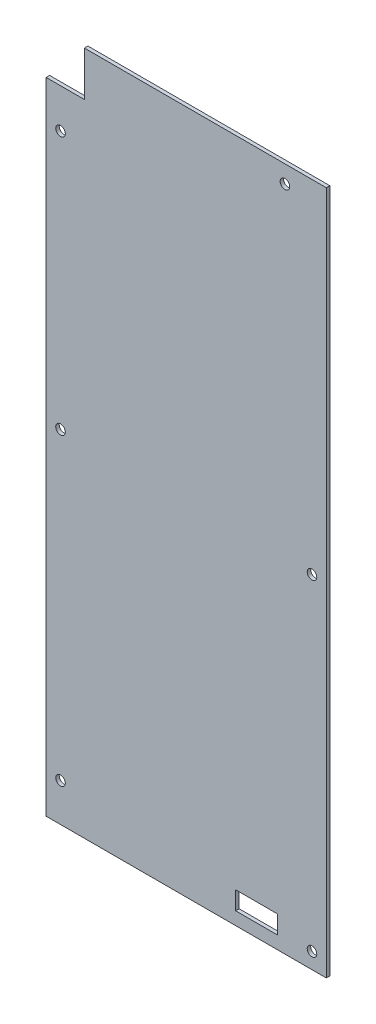
ISO-10303-21;
HEADER;
FILE_DESCRIPTION(('STEP AP214'),'2;1');
FILE_NAME('part.step','',(''),(''),'','','');
FILE_SCHEMA(('AUTOMOTIVE_DESIGN { 1 0 10303 214 1 1 1 1 }'));
ENDSEC;
DATA;
#1=APPLICATION_CONTEXT('core data for automotive mechanical design processes');
#2=APPLICATION_PROTOCOL_DEFINITION('international standard','automotive_design',2000,#1);
#3=PRODUCT_CONTEXT('',#1,'mechanical');
#4=PRODUCT('Part','Part','',(#3));
#5=PRODUCT_RELATED_PRODUCT_CATEGORY('part','',(#4));
#6=PRODUCT_DEFINITION_FORMATION('','',#4);
#7=PRODUCT_DEFINITION_CONTEXT('part definition',#1,'design');
#8=PRODUCT_DEFINITION('design','',#6,#7);
#9=PRODUCT_DEFINITION_SHAPE('','',#8);
#10=(LENGTH_UNIT() NAMED_UNIT(*) SI_UNIT(.MILLI.,.METRE.));
#11=(NAMED_UNIT(*) PLANE_ANGLE_UNIT() SI_UNIT($,.RADIAN.));
#12=(NAMED_UNIT(*) SI_UNIT($,.STERADIAN.) SOLID_ANGLE_UNIT());
#13=UNCERTAINTY_MEASURE_WITH_UNIT(LENGTH_MEASURE(1.E-05),#10,'distance_accuracy_value','');
#14=(GEOMETRIC_REPRESENTATION_CONTEXT(3) GLOBAL_UNCERTAINTY_ASSIGNED_CONTEXT((#13)) GLOBAL_UNIT_ASSIGNED_CONTEXT((#10,
#11,#12)) REPRESENTATION_CONTEXT('',''));
#15=CARTESIAN_POINT('',(0.,0.,0.));
#16=DIRECTION('',(0.,0.,1.));
#17=DIRECTION('',(1.,0.,0.));
#18=AXIS2_PLACEMENT_3D('',#15,#16,#17);
#19=CARTESIAN_POINT('',(-43.4054880311596,36.5751828079822,1.1));
#20=DIRECTION('',(1.,0.,0.));
#21=DIRECTION('',(0.,0.,-1.));
#22=AXIS2_PLACEMENT_3D('',#19,#20,#21);
#23=PLANE('',#22);
#24=DIRECTION('',(0.,-1.,0.));
#25=VECTOR('',#24,1.);
#26=CARTESIAN_POINT('',(-43.4054880311596,36.5751828079822,1.1));
#27=LINE('',#26,#25);
#28=CARTESIAN_POINT('',(-43.4054880311596,22.5761319376729,1.1));
#29=VERTEX_POINT('',#28);
#30=CARTESIAN_POINT('',(-43.4054880311596,-178.424817192018,1.1));
#31=VERTEX_POINT('',#30);
#32=EDGE_CURVE('E220',#29,#31,#27,.T.);
#33=ORIENTED_EDGE('',*,*,#32,.F.);
#34=DIRECTION('',(0.,0.,1.));
#35=VECTOR('',#34,1.);
#36=CARTESIAN_POINT('',(-43.4054880311596,22.5761319376729,0.));
#37=LINE('',#36,#35);
#38=CARTESIAN_POINT('',(-43.4054880311596,22.5761319376729,0.));
#39=VERTEX_POINT('',#38);
#40=EDGE_CURVE('E174',#39,#29,#37,.T.);
#41=ORIENTED_EDGE('',*,*,#40,.F.);
#42=DIRECTION('',(0.,-1.,0.));
#43=VECTOR('',#42,1.);
#44=CARTESIAN_POINT('',(-43.4054880311596,36.5751828079822,0.));
#45=LINE('',#44,#43);
#46=CARTESIAN_POINT('',(-43.4054880311596,-178.424817192018,0.));
#47=VERTEX_POINT('',#46);
#48=EDGE_CURVE('E219',#39,#47,#45,.T.);
#49=ORIENTED_EDGE('',*,*,#48,.T.);
#50=DIRECTION('',(0.,0.,-1.));
#51=VECTOR('',#50,1.);
#52=CARTESIAN_POINT('',(-43.4054880311596,-178.424817192018,1.1));
#53=LINE('',#52,#51);
#54=EDGE_CURVE('E12',#31,#47,#53,.T.);
#55=ORIENTED_EDGE('',*,*,#54,.F.);
#56=EDGE_LOOP('',(#33,#41,#49,#55));
#57=FACE_BOUND('',#56,.T.);
#58=ADVANCED_FACE('F44',(#57),#23,.F.);
#59=CARTESIAN_POINT('',(-43.4054880311596,-178.424817192018,1.1));
#60=DIRECTION('',(0.,1.,0.));
#61=DIRECTION('',(-1.,0.,0.));
#62=AXIS2_PLACEMENT_3D('',#59,#60,#61);
#63=PLANE('',#62);
#64=DIRECTION('',(1.,0.,0.));
#65=VECTOR('',#64,1.);
#66=CARTESIAN_POINT('',(-43.4054880311596,-178.424817192018,0.));
#67=LINE('',#66,#65);
#68=CARTESIAN_POINT('',(44.5945119688404,-178.424817192018,0.));
#69=VERTEX_POINT('',#68);
#70=EDGE_CURVE('E233',#47,#69,#67,.T.);
#71=ORIENTED_EDGE('',*,*,#70,.T.);
#72=DIRECTION('',(0.,0.,-1.));
#73=VECTOR('',#72,1.);
#74=CARTESIAN_POINT('',(44.5945119688404,-178.424817192018,1.1));
#75=LINE('',#74,#73);
#76=CARTESIAN_POINT('',(44.5945119688404,-178.424817192018,1.1));
#77=VERTEX_POINT('',#76);
#78=EDGE_CURVE('E52',#77,#69,#75,.T.);
#79=ORIENTED_EDGE('',*,*,#78,.F.);
#80=DIRECTION('',(1.,0.,0.));
#81=VECTOR('',#80,1.);
#82=CARTESIAN_POINT('',(-43.4054880311596,-178.424817192018,1.1));
#83=LINE('',#82,#81);
#84=EDGE_CURVE('E222',#31,#77,#83,.T.);
#85=ORIENTED_EDGE('',*,*,#84,.F.);
#86=ORIENTED_EDGE('',*,*,#54,.T.);
#87=EDGE_LOOP('',(#71,#79,#85,#86));
#88=FACE_BOUND('',#87,.T.);
#89=ADVANCED_FACE('F256',(#88),#63,.F.);
#90=CARTESIAN_POINT('',(44.5945119688404,36.5751828079822,1.1));
#91=DIRECTION('',(-1.,0.,0.));
#92=DIRECTION('',(0.,0.,1.));
#93=AXIS2_PLACEMENT_3D('',#90,#91,#92);
#94=PLANE('',#93);
#95=DIRECTION('',(0.,1.,0.));
#96=VECTOR('',#95,1.);
#97=CARTESIAN_POINT('',(44.5945119688404,36.5751828079822,0.));
#98=LINE('',#97,#96);
#99=CARTESIAN_POINT('',(44.5945119688404,36.5751828079822,0.));
#100=VERTEX_POINT('',#99);
#101=EDGE_CURVE('E239',#69,#100,#98,.T.);
#102=ORIENTED_EDGE('',*,*,#101,.T.);
#103=DIRECTION('',(0.,0.,-1.));
#104=VECTOR('',#103,1.);
#105=CARTESIAN_POINT('',(44.5945119688404,36.5751828079822,1.1));
#106=LINE('',#105,#104);
#107=CARTESIAN_POINT('',(44.5945119688404,36.5751828079822,1.1));
#108=VERTEX_POINT('',#107);
#109=EDGE_CURVE('E230',#108,#100,#106,.T.);
#110=ORIENTED_EDGE('',*,*,#109,.F.);
#111=DIRECTION('',(0.,1.,0.));
#112=VECTOR('',#111,1.);
#113=CARTESIAN_POINT('',(44.5945119688404,36.5751828079822,1.1));
#114=LINE('',#113,#112);
#115=EDGE_CURVE('E225',#77,#108,#114,.T.);
#116=ORIENTED_EDGE('',*,*,#115,.F.);
#117=ORIENTED_EDGE('',*,*,#78,.T.);
#118=EDGE_LOOP('',(#102,#110,#116,#117));
#119=FACE_BOUND('',#118,.T.);
#120=ADVANCED_FACE('F248',(#119),#94,.F.);
#121=CARTESIAN_POINT('',(-43.4054880311596,36.5751828079822,1.1));
#122=DIRECTION('',(0.,-1.,0.));
#123=DIRECTION('',(0.,0.,-1.));
#124=AXIS2_PLACEMENT_3D('',#121,#122,#123);
#125=PLANE('',#124);
#126=DIRECTION('',(-1.,0.,0.));
#127=VECTOR('',#126,1.);
#128=CARTESIAN_POINT('',(-43.4054880311596,36.5751828079822,0.));
#129=LINE('',#128,#127);
#130=CARTESIAN_POINT('',(-31.4054880311596,36.5751828079822,0.));
#131=VERTEX_POINT('',#130);
#132=EDGE_CURVE('E223',#100,#131,#129,.T.);
#133=ORIENTED_EDGE('',*,*,#132,.T.);
#134=DIRECTION('',(0.,0.,1.));
#135=VECTOR('',#134,1.);
#136=CARTESIAN_POINT('',(-31.4054880311596,36.5751828079822,0.));
#137=LINE('',#136,#135);
#138=CARTESIAN_POINT('',(-31.4054880311596,36.5751828079822,1.1));
#139=VERTEX_POINT('',#138);
#140=EDGE_CURVE('E169',#131,#139,#137,.T.);
#141=ORIENTED_EDGE('',*,*,#140,.T.);
#142=DIRECTION('',(-1.,0.,0.));
#143=VECTOR('',#142,1.);
#144=CARTESIAN_POINT('',(-43.4054880311596,36.5751828079822,1.1));
#145=LINE('',#144,#143);
#146=EDGE_CURVE('E227',#108,#139,#145,.T.);
#147=ORIENTED_EDGE('',*,*,#146,.F.);
#148=ORIENTED_EDGE('',*,*,#109,.T.);
#149=EDGE_LOOP('',(#133,#141,#147,#148));
#150=FACE_BOUND('',#149,.T.);
#151=ADVANCED_FACE('F270',(#150),#125,.F.);
#152=CARTESIAN_POINT('',(0.,0.,1.1));
#153=DIRECTION('',(0.,0.,1.));
#154=DIRECTION('',(1.,0.,0.));
#155=AXIS2_PLACEMENT_3D('',#152,#153,#154);
#156=PLANE('',#155);
#157=DIRECTION('',(0.,-1.,0.));
#158=VECTOR('',#157,1.);
#159=CARTESIAN_POINT('',(16.1045119688404,-168.664817192018,1.1));
#160=LINE('',#159,#158);
#161=CARTESIAN_POINT('',(16.1045119688404,-168.664817192018,1.1));
#162=VERTEX_POINT('',#161);
#163=CARTESIAN_POINT('',(16.1045119688404,-174.384817192018,1.1));
#164=VERTEX_POINT('',#163);
#165=EDGE_CURVE('E60',#162,#164,#160,.T.);
#166=ORIENTED_EDGE('',*,*,#165,.F.);
#167=DIRECTION('',(-1.,0.,0.));
#168=VECTOR('',#167,1.);
#169=CARTESIAN_POINT('',(16.1045119688404,-168.664817192018,1.1));
#170=LINE('',#169,#168);
#171=CARTESIAN_POINT('',(29.2045119688404,-168.664817192018,1.1));
#172=VERTEX_POINT('',#171);
#173=EDGE_CURVE('E140',#172,#162,#170,.T.);
#174=ORIENTED_EDGE('',*,*,#173,.F.);
#175=DIRECTION('',(0.,1.,0.));
#176=VECTOR('',#175,1.);
#177=CARTESIAN_POINT('',(29.2045119688404,-168.664817192018,1.1));
#178=LINE('',#177,#176);
#179=CARTESIAN_POINT('',(29.2045119688404,-174.384817192018,1.1));
#180=VERTEX_POINT('',#179);
#181=EDGE_CURVE('E143',#180,#172,#178,.T.);
#182=ORIENTED_EDGE('',*,*,#181,.F.);
#183=DIRECTION('',(1.,0.,0.));
#184=VECTOR('',#183,1.);
#185=CARTESIAN_POINT('',(16.1045119688404,-174.384817192018,1.1));
#186=LINE('',#185,#184);
#187=EDGE_CURVE('E149',#164,#180,#186,.T.);
#188=ORIENTED_EDGE('',*,*,#187,.F.);
#189=EDGE_LOOP('',(#166,#174,#182,#188));
#190=FACE_BOUND('',#189,.T.);
#191=CARTESIAN_POINT('',(40.0945119688406,-173.424817192018,1.1));
#192=DIRECTION('',(0.,0.,1.));
#193=DIRECTION('',(1.,0.,0.));
#194=AXIS2_PLACEMENT_3D('',#191,#192,#193);
#195=CIRCLE('',#194,1.5);
#196=CARTESIAN_POINT('',(41.5945119688406,-173.424817192018,1.1));
#197=VERTEX_POINT('',#196);
#198=EDGE_CURVE('E216',#197,#197,#195,.T.);
#199=ORIENTED_EDGE('',*,*,#198,.F.);
#200=EDGE_LOOP('',(#199));
#201=FACE_BOUND('',#200,.T.);
#202=CARTESIAN_POINT('',(40.0945119688404,-70.9248171920178,1.1));
#203=DIRECTION('',(0.,0.,1.));
#204=DIRECTION('',(1.,0.,0.));
#205=AXIS2_PLACEMENT_3D('',#202,#203,#204);
#206=CIRCLE('',#205,1.5);
#207=CARTESIAN_POINT('',(41.5945119688404,-70.9248171920178,1.1));
#208=VERTEX_POINT('',#207);
#209=EDGE_CURVE('E213',#208,#208,#206,.T.);
#210=ORIENTED_EDGE('',*,*,#209,.F.);
#211=EDGE_LOOP('',(#210));
#212=FACE_BOUND('',#211,.T.);
#213=CARTESIAN_POINT('',(-38.9054880311596,10.2551828079822,1.1));
#214=DIRECTION('',(0.,0.,1.));
#215=DIRECTION('',(1.,0.,0.));
#216=AXIS2_PLACEMENT_3D('',#213,#214,#215);
#217=CIRCLE('',#216,1.50000000000198);
#218=CARTESIAN_POINT('',(-37.4054880311576,10.2551828079822,1.1));
#219=VERTEX_POINT('',#218);
#220=EDGE_CURVE('E210',#219,#219,#217,.T.);
#221=ORIENTED_EDGE('',*,*,#220,.F.);
#222=EDGE_LOOP('',(#221));
#223=FACE_BOUND('',#222,.T.);
#224=CARTESIAN_POINT('',(-38.9054880311596,-70.9248171920178,1.1));
#225=DIRECTION('',(0.,0.,1.));
#226=DIRECTION('',(1.,0.,0.));
#227=AXIS2_PLACEMENT_3D('',#224,#225,#226);
#228=CIRCLE('',#227,1.5);
#229=CARTESIAN_POINT('',(-37.4054880311596,-70.9248171920178,1.1));
#230=VERTEX_POINT('',#229);
#231=EDGE_CURVE('E207',#230,#230,#228,.T.);
#232=ORIENTED_EDGE('',*,*,#231,.F.);
#233=EDGE_LOOP('',(#232));
#234=FACE_BOUND('',#233,.T.);
#235=CARTESIAN_POINT('',(-38.9054880311596,-166.424817192018,1.1));
#236=DIRECTION('',(0.,0.,1.));
#237=DIRECTION('',(1.,0.,0.));
#238=AXIS2_PLACEMENT_3D('',#235,#236,#237);
#239=CIRCLE('',#238,1.5);
#240=CARTESIAN_POINT('',(-37.4054880311596,-166.424817192018,1.1));
#241=VERTEX_POINT('',#240);
#242=EDGE_CURVE('E204',#241,#241,#239,.T.);
#243=ORIENTED_EDGE('',*,*,#242,.F.);
#244=EDGE_LOOP('',(#243));
#245=FACE_BOUND('',#244,.T.);
#246=CARTESIAN_POINT('',(31.5945119688404,31.0751828079823,1.1));
#247=DIRECTION('',(0.,0.,1.));
#248=DIRECTION('',(1.,0.,0.));
#249=AXIS2_PLACEMENT_3D('',#246,#247,#248);
#250=CIRCLE('',#249,1.50000000000098);
#251=CARTESIAN_POINT('',(33.0945119688414,31.0751828079823,1.1));
#252=VERTEX_POINT('',#251);
#253=EDGE_CURVE('E201',#252,#252,#250,.T.);
#254=ORIENTED_EDGE('',*,*,#253,.F.);
#255=EDGE_LOOP('',(#254));
#256=FACE_BOUND('',#255,.T.);
#257=DIRECTION('',(0.,1.,0.));
#258=VECTOR('',#257,1.);
#259=CARTESIAN_POINT('',(-31.4054880311596,0.,1.1));
#260=LINE('',#259,#258);
#261=CARTESIAN_POINT('',(-31.4054880311596,22.5761319376729,1.1));
#262=VERTEX_POINT('',#261);
#263=EDGE_CURVE('E199',#262,#139,#260,.T.);
#264=ORIENTED_EDGE('',*,*,#263,.F.);
#265=DIRECTION('',(1.,0.,0.));
#266=VECTOR('',#265,1.);
#267=CARTESIAN_POINT('',(0.,22.5761319376729,1.1));
#268=LINE('',#267,#266);
#269=EDGE_CURVE('E182',#29,#262,#268,.T.);
#270=ORIENTED_EDGE('',*,*,#269,.F.);
#271=ORIENTED_EDGE('',*,*,#32,.T.);
#272=ORIENTED_EDGE('',*,*,#84,.T.);
#273=ORIENTED_EDGE('',*,*,#115,.T.);
#274=ORIENTED_EDGE('',*,*,#146,.T.);
#275=EDGE_LOOP('',(#264,#270,#271,#272,#273,#274));
#276=FACE_BOUND('',#275,.T.);
#277=ADVANCED_FACE('F272',(#190,#201,#212,#223,#234,#245,#256,#276),#156,.T.);
#278=CARTESIAN_POINT('',(0.,0.,0.));
#279=DIRECTION('',(0.,0.,1.));
#280=DIRECTION('',(1.,0.,0.));
#281=AXIS2_PLACEMENT_3D('',#278,#279,#280);
#282=PLANE('',#281);
#283=DIRECTION('',(-1.,0.,0.));
#284=VECTOR('',#283,1.);
#285=CARTESIAN_POINT('',(16.1045119688404,-168.664817192018,0.));
#286=LINE('',#285,#284);
#287=CARTESIAN_POINT('',(29.2045119688404,-168.664817192018,0.));
#288=VERTEX_POINT('',#287);
#289=CARTESIAN_POINT('',(16.1045119688404,-168.664817192018,0.));
#290=VERTEX_POINT('',#289);
#291=EDGE_CURVE('E130',#288,#290,#286,.T.);
#292=ORIENTED_EDGE('',*,*,#291,.T.);
#293=DIRECTION('',(0.,-1.,0.));
#294=VECTOR('',#293,1.);
#295=CARTESIAN_POINT('',(16.1045119688404,-168.664817192018,0.));
#296=LINE('',#295,#294);
#297=CARTESIAN_POINT('',(16.1045119688404,-174.384817192018,0.));
#298=VERTEX_POINT('',#297);
#299=EDGE_CURVE('E124',#290,#298,#296,.T.);
#300=ORIENTED_EDGE('',*,*,#299,.T.);
#301=DIRECTION('',(1.,0.,0.));
#302=VECTOR('',#301,1.);
#303=CARTESIAN_POINT('',(16.1045119688404,-174.384817192018,0.));
#304=LINE('',#303,#302);
#305=CARTESIAN_POINT('',(29.2045119688404,-174.384817192018,0.));
#306=VERTEX_POINT('',#305);
#307=EDGE_CURVE('E133',#298,#306,#304,.T.);
#308=ORIENTED_EDGE('',*,*,#307,.T.);
#309=DIRECTION('',(0.,1.,0.));
#310=VECTOR('',#309,1.);
#311=CARTESIAN_POINT('',(29.2045119688404,-168.664817192018,0.));
#312=LINE('',#311,#310);
#313=EDGE_CURVE('E68',#306,#288,#312,.T.);
#314=ORIENTED_EDGE('',*,*,#313,.T.);
#315=EDGE_LOOP('',(#292,#300,#308,#314));
#316=FACE_BOUND('',#315,.T.);
#317=CARTESIAN_POINT('',(40.0945119688406,-173.424817192018,0.));
#318=DIRECTION('',(0.,0.,1.));
#319=DIRECTION('',(1.,0.,0.));
#320=AXIS2_PLACEMENT_3D('',#317,#318,#319);
#321=CIRCLE('',#320,1.5);
#322=CARTESIAN_POINT('',(41.5945119688406,-173.424817192018,0.));
#323=VERTEX_POINT('',#322);
#324=EDGE_CURVE('E47',#323,#323,#321,.T.);
#325=ORIENTED_EDGE('',*,*,#324,.T.);
#326=EDGE_LOOP('',(#325));
#327=FACE_BOUND('',#326,.T.);
#328=CARTESIAN_POINT('',(40.0945119688404,-70.9248171920178,0.));
#329=DIRECTION('',(0.,0.,1.));
#330=DIRECTION('',(1.,0.,0.));
#331=AXIS2_PLACEMENT_3D('',#328,#329,#330);
#332=CIRCLE('',#331,1.5);
#333=CARTESIAN_POINT('',(41.5945119688404,-70.9248171920178,0.));
#334=VERTEX_POINT('',#333);
#335=EDGE_CURVE('E155',#334,#334,#332,.T.);
#336=ORIENTED_EDGE('',*,*,#335,.T.);
#337=EDGE_LOOP('',(#336));
#338=FACE_BOUND('',#337,.T.);
#339=CARTESIAN_POINT('',(-38.9054880311596,10.2551828079822,0.));
#340=DIRECTION('',(0.,0.,1.));
#341=DIRECTION('',(1.,0.,0.));
#342=AXIS2_PLACEMENT_3D('',#339,#340,#341);
#343=CIRCLE('',#342,1.50000000000198);
#344=CARTESIAN_POINT('',(-37.4054880311576,10.2551828079822,0.));
#345=VERTEX_POINT('',#344);
#346=EDGE_CURVE('E166',#345,#345,#343,.T.);
#347=ORIENTED_EDGE('',*,*,#346,.T.);
#348=EDGE_LOOP('',(#347));
#349=FACE_BOUND('',#348,.T.);
#350=CARTESIAN_POINT('',(-38.9054880311596,-70.9248171920178,0.));
#351=DIRECTION('',(0.,0.,1.));
#352=DIRECTION('',(1.,0.,0.));
#353=AXIS2_PLACEMENT_3D('',#350,#351,#352);
#354=CIRCLE('',#353,1.5);
#355=CARTESIAN_POINT('',(-37.4054880311596,-70.9248171920178,0.));
#356=VERTEX_POINT('',#355);
#357=EDGE_CURVE('E162',#356,#356,#354,.T.);
#358=ORIENTED_EDGE('',*,*,#357,.T.);
#359=EDGE_LOOP('',(#358));
#360=FACE_BOUND('',#359,.T.);
#361=CARTESIAN_POINT('',(-38.9054880311596,-166.424817192018,0.));
#362=DIRECTION('',(0.,0.,1.));
#363=DIRECTION('',(1.,0.,0.));
#364=AXIS2_PLACEMENT_3D('',#361,#362,#363);
#365=CIRCLE('',#364,1.5);
#366=CARTESIAN_POINT('',(-37.4054880311596,-166.424817192018,0.));
#367=VERTEX_POINT('',#366);
#368=EDGE_CURVE('E159',#367,#367,#365,.T.);
#369=ORIENTED_EDGE('',*,*,#368,.T.);
#370=EDGE_LOOP('',(#369));
#371=FACE_BOUND('',#370,.T.);
#372=CARTESIAN_POINT('',(31.5945119688404,31.0751828079823,-4.3298697960376E-13));
#373=DIRECTION('',(0.,0.,1.));
#374=DIRECTION('',(1.,0.,0.));
#375=AXIS2_PLACEMENT_3D('',#372,#373,#374);
#376=CIRCLE('',#375,1.50000000000098);
#377=CARTESIAN_POINT('',(33.0945119688414,31.0751828079823,-4.3298697960376E-13));
#378=VERTEX_POINT('',#377);
#379=EDGE_CURVE('E163',#378,#378,#376,.T.);
#380=ORIENTED_EDGE('',*,*,#379,.T.);
#381=EDGE_LOOP('',(#380));
#382=FACE_BOUND('',#381,.T.);
#383=DIRECTION('',(1.,0.,0.));
#384=VECTOR('',#383,1.);
#385=CARTESIAN_POINT('',(-43.4054880311596,22.5761319376729,0.));
#386=LINE('',#385,#384);
#387=CARTESIAN_POINT('',(-31.4054880311596,22.5761319376729,0.));
#388=VERTEX_POINT('',#387);
#389=EDGE_CURVE('E176',#39,#388,#386,.T.);
#390=ORIENTED_EDGE('',*,*,#389,.T.);
#391=DIRECTION('',(0.,1.,0.));
#392=VECTOR('',#391,1.);
#393=CARTESIAN_POINT('',(-31.4054880311596,36.5751828079822,0.));
#394=LINE('',#393,#392);
#395=EDGE_CURVE('E177',#388,#131,#394,.T.);
#396=ORIENTED_EDGE('',*,*,#395,.T.);
#397=ORIENTED_EDGE('',*,*,#132,.F.);
#398=ORIENTED_EDGE('',*,*,#101,.F.);
#399=ORIENTED_EDGE('',*,*,#70,.F.);
#400=ORIENTED_EDGE('',*,*,#48,.F.);
#401=EDGE_LOOP('',(#390,#396,#397,#398,#399,#400));
#402=FACE_BOUND('',#401,.T.);
#403=ADVANCED_FACE('F137',(#316,#327,#338,#349,#360,#371,#382,#402),#282,.F.);
#404=CARTESIAN_POINT('',(-31.4054880311596,36.5751828079822,0.));
#405=DIRECTION('',(1.,0.,0.));
#406=DIRECTION('',(0.,0.,-1.));
#407=AXIS2_PLACEMENT_3D('',#404,#405,#406);
#408=PLANE('',#407);
#409=ORIENTED_EDGE('',*,*,#263,.T.);
#410=ORIENTED_EDGE('',*,*,#140,.F.);
#411=ORIENTED_EDGE('',*,*,#395,.F.);
#412=DIRECTION('',(0.,0.,1.));
#413=VECTOR('',#412,1.);
#414=CARTESIAN_POINT('',(-31.4054880311596,22.5761319376729,0.));
#415=LINE('',#414,#413);
#416=EDGE_CURVE('E185',#388,#262,#415,.T.);
#417=ORIENTED_EDGE('',*,*,#416,.T.);
#418=EDGE_LOOP('',(#409,#410,#411,#417));
#419=FACE_BOUND('',#418,.T.);
#420=ADVANCED_FACE('F267',(#419),#408,.F.);
#421=CARTESIAN_POINT('',(-43.4054880311596,22.5761319376729,0.));
#422=DIRECTION('',(0.,-1.,0.));
#423=DIRECTION('',(1.,0.,0.));
#424=AXIS2_PLACEMENT_3D('',#421,#422,#423);
#425=PLANE('',#424);
#426=ORIENTED_EDGE('',*,*,#269,.T.);
#427=ORIENTED_EDGE('',*,*,#416,.F.);
#428=ORIENTED_EDGE('',*,*,#389,.F.);
#429=ORIENTED_EDGE('',*,*,#40,.T.);
#430=EDGE_LOOP('',(#426,#427,#428,#429));
#431=FACE_BOUND('',#430,.T.);
#432=ADVANCED_FACE('F263',(#431),#425,.F.);
#433=CARTESIAN_POINT('',(31.5945119688404,31.0751828079823,-4.3298697960376E-13));
#434=DIRECTION('',(0.,0.,1.));
#435=DIRECTION('',(1.,0.,0.));
#436=AXIS2_PLACEMENT_3D('',#433,#434,#435);
#437=CYLINDRICAL_SURFACE('',#436,1.50000000000098);
#438=ORIENTED_EDGE('',*,*,#253,.T.);
#439=EDGE_LOOP('',(#438));
#440=FACE_BOUND('',#439,.T.);
#441=ORIENTED_EDGE('',*,*,#379,.F.);
#442=EDGE_LOOP('',(#441));
#443=FACE_BOUND('',#442,.T.);
#444=ADVANCED_FACE('F311',(#440,#443),#437,.F.);
#445=CARTESIAN_POINT('',(-38.9054880311596,-166.424817192018,0.));
#446=DIRECTION('',(0.,0.,1.));
#447=DIRECTION('',(1.,0.,0.));
#448=AXIS2_PLACEMENT_3D('',#445,#446,#447);
#449=CYLINDRICAL_SURFACE('',#448,1.5);
#450=ORIENTED_EDGE('',*,*,#242,.T.);
#451=EDGE_LOOP('',(#450));
#452=FACE_BOUND('',#451,.T.);
#453=ORIENTED_EDGE('',*,*,#368,.F.);
#454=EDGE_LOOP('',(#453));
#455=FACE_BOUND('',#454,.T.);
#456=ADVANCED_FACE('F327',(#452,#455),#449,.F.);
#457=CARTESIAN_POINT('',(-38.9054880311596,-70.9248171920178,0.));
#458=DIRECTION('',(0.,0.,1.));
#459=DIRECTION('',(1.,0.,0.));
#460=AXIS2_PLACEMENT_3D('',#457,#458,#459);
#461=CYLINDRICAL_SURFACE('',#460,1.5);
#462=ORIENTED_EDGE('',*,*,#231,.T.);
#463=EDGE_LOOP('',(#462));
#464=FACE_BOUND('',#463,.T.);
#465=ORIENTED_EDGE('',*,*,#357,.F.);
#466=EDGE_LOOP('',(#465));
#467=FACE_BOUND('',#466,.T.);
#468=ADVANCED_FACE('F337',(#464,#467),#461,.F.);
#469=CARTESIAN_POINT('',(-38.9054880311596,10.2551828079822,0.));
#470=DIRECTION('',(0.,0.,1.));
#471=DIRECTION('',(1.,0.,0.));
#472=AXIS2_PLACEMENT_3D('',#469,#470,#471);
#473=CYLINDRICAL_SURFACE('',#472,1.50000000000198);
#474=ORIENTED_EDGE('',*,*,#220,.T.);
#475=EDGE_LOOP('',(#474));
#476=FACE_BOUND('',#475,.T.);
#477=ORIENTED_EDGE('',*,*,#346,.F.);
#478=EDGE_LOOP('',(#477));
#479=FACE_BOUND('',#478,.T.);
#480=ADVANCED_FACE('F347',(#476,#479),#473,.F.);
#481=CARTESIAN_POINT('',(40.0945119688404,-70.9248171920178,0.));
#482=DIRECTION('',(0.,0.,1.));
#483=DIRECTION('',(1.,0.,0.));
#484=AXIS2_PLACEMENT_3D('',#481,#482,#483);
#485=CYLINDRICAL_SURFACE('',#484,1.5);
#486=ORIENTED_EDGE('',*,*,#209,.T.);
#487=EDGE_LOOP('',(#486));
#488=FACE_BOUND('',#487,.T.);
#489=ORIENTED_EDGE('',*,*,#335,.F.);
#490=EDGE_LOOP('',(#489));
#491=FACE_BOUND('',#490,.T.);
#492=ADVANCED_FACE('F357',(#488,#491),#485,.F.);
#493=CARTESIAN_POINT('',(40.0945119688406,-173.424817192018,-0.0400520185751729));
#494=DIRECTION('',(0.,0.,1.));
#495=DIRECTION('',(1.,0.,0.));
#496=AXIS2_PLACEMENT_3D('',#493,#494,#495);
#497=CYLINDRICAL_SURFACE('',#496,1.5);
#498=ORIENTED_EDGE('',*,*,#198,.T.);
#499=EDGE_LOOP('',(#498));
#500=FACE_BOUND('',#499,.T.);
#501=ORIENTED_EDGE('',*,*,#324,.F.);
#502=EDGE_LOOP('',(#501));
#503=FACE_BOUND('',#502,.T.);
#504=ADVANCED_FACE('F367',(#500,#503),#497,.F.);
#505=CARTESIAN_POINT('',(16.1045119688404,-168.664817192018,0.));
#506=DIRECTION('',(-1.,0.,0.));
#507=DIRECTION('',(0.,-1.,0.));
#508=AXIS2_PLACEMENT_3D('',#505,#506,#507);
#509=PLANE('',#508);
#510=ORIENTED_EDGE('',*,*,#165,.T.);
#511=DIRECTION('',(0.,0.,1.));
#512=VECTOR('',#511,1.);
#513=CARTESIAN_POINT('',(16.1045119688404,-174.384817192018,0.));
#514=LINE('',#513,#512);
#515=EDGE_CURVE('E120',#298,#164,#514,.T.);
#516=ORIENTED_EDGE('',*,*,#515,.F.);
#517=ORIENTED_EDGE('',*,*,#299,.F.);
#518=DIRECTION('',(0.,0.,1.));
#519=VECTOR('',#518,1.);
#520=CARTESIAN_POINT('',(16.1045119688404,-168.664817192018,0.));
#521=LINE('',#520,#519);
#522=EDGE_CURVE('E153',#290,#162,#521,.T.);
#523=ORIENTED_EDGE('',*,*,#522,.T.);
#524=EDGE_LOOP('',(#510,#516,#517,#523));
#525=FACE_BOUND('',#524,.T.);
#526=ADVANCED_FACE('F122',(#525),#509,.F.);
#527=CARTESIAN_POINT('',(16.1045119688404,-168.664817192018,0.));
#528=DIRECTION('',(0.,1.,0.));
#529=DIRECTION('',(0.,0.,1.));
#530=AXIS2_PLACEMENT_3D('',#527,#528,#529);
#531=PLANE('',#530);
#532=ORIENTED_EDGE('',*,*,#173,.T.);
#533=ORIENTED_EDGE('',*,*,#522,.F.);
#534=ORIENTED_EDGE('',*,*,#291,.F.);
#535=DIRECTION('',(0.,0.,1.));
#536=VECTOR('',#535,1.);
#537=CARTESIAN_POINT('',(29.2045119688404,-168.664817192018,0.));
#538=LINE('',#537,#536);
#539=EDGE_CURVE('E156',#288,#172,#538,.T.);
#540=ORIENTED_EDGE('',*,*,#539,.T.);
#541=EDGE_LOOP('',(#532,#533,#534,#540));
#542=FACE_BOUND('',#541,.T.);
#543=ADVANCED_FACE('F394',(#542),#531,.F.);
#544=CARTESIAN_POINT('',(29.2045119688404,-168.664817192018,0.));
#545=DIRECTION('',(1.,0.,0.));
#546=DIRECTION('',(0.,1.,0.));
#547=AXIS2_PLACEMENT_3D('',#544,#545,#546);
#548=PLANE('',#547);
#549=ORIENTED_EDGE('',*,*,#181,.T.);
#550=ORIENTED_EDGE('',*,*,#539,.F.);
#551=ORIENTED_EDGE('',*,*,#313,.F.);
#552=DIRECTION('',(0.,0.,1.));
#553=VECTOR('',#552,1.);
#554=CARTESIAN_POINT('',(29.2045119688404,-174.384817192018,0.));
#555=LINE('',#554,#553);
#556=EDGE_CURVE('E129',#306,#180,#555,.T.);
#557=ORIENTED_EDGE('',*,*,#556,.T.);
#558=EDGE_LOOP('',(#549,#550,#551,#557));
#559=FACE_BOUND('',#558,.T.);
#560=ADVANCED_FACE('F403',(#559),#548,.F.);
#561=CARTESIAN_POINT('',(16.1045119688404,-174.384817192018,0.));
#562=DIRECTION('',(0.,-1.,0.));
#563=DIRECTION('',(0.,0.,-1.));
#564=AXIS2_PLACEMENT_3D('',#561,#562,#563);
#565=PLANE('',#564);
#566=ORIENTED_EDGE('',*,*,#187,.T.);
#567=ORIENTED_EDGE('',*,*,#556,.F.);
#568=ORIENTED_EDGE('',*,*,#307,.F.);
#569=ORIENTED_EDGE('',*,*,#515,.T.);
#570=EDGE_LOOP('',(#566,#567,#568,#569));
#571=FACE_BOUND('',#570,.T.);
#572=ADVANCED_FACE('F134',(#571),#565,.F.);
#573=CLOSED_SHELL('',(#58,#89,#120,#151,#277,#403,#420,#432,#444,#456,#468,#480,#492,#504,#526,
#543,#560,#572));
#574=MANIFOLD_SOLID_BREP('B2',#573);
#575=ADVANCED_BREP_SHAPE_REPRESENTATION('',(#18,#574),#14);
#576=SHAPE_DEFINITION_REPRESENTATION(#9,#575);
ENDSEC;
END-ISO-10303-21;
